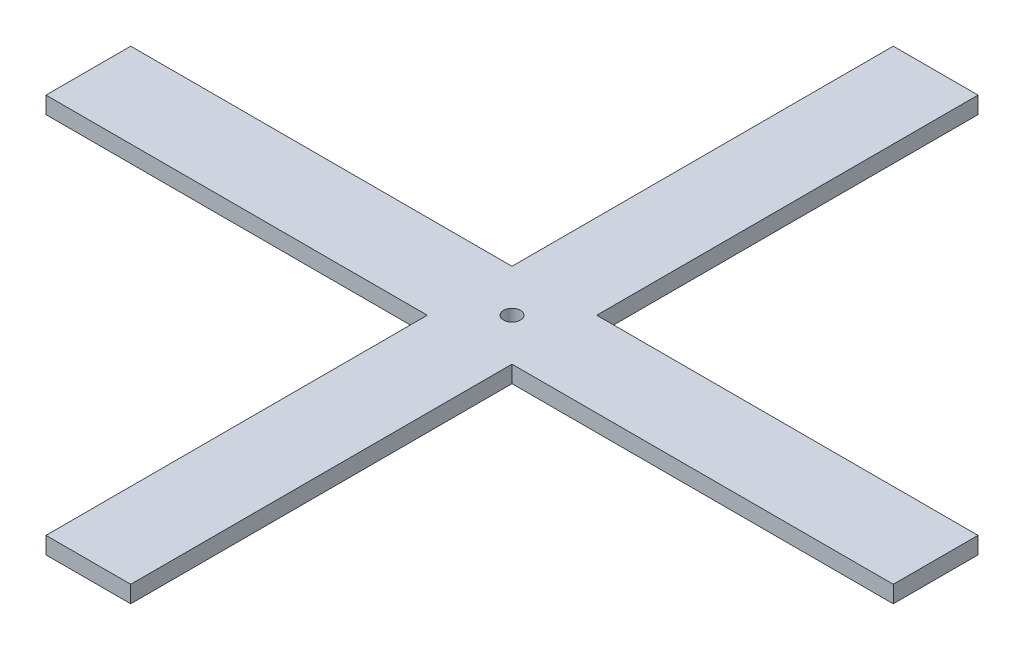
ISO-10303-21;
HEADER;
FILE_DESCRIPTION(('STEP AP214'),'2;1');
FILE_NAME('part.step','',(''),(''),'','','');
FILE_SCHEMA(('AUTOMOTIVE_DESIGN { 1 0 10303 214 1 1 1 1 }'));
ENDSEC;
DATA;
#1=APPLICATION_CONTEXT('core data for automotive mechanical design processes');
#2=APPLICATION_PROTOCOL_DEFINITION('international standard','automotive_design',2000,#1);
#3=PRODUCT_CONTEXT('',#1,'mechanical');
#4=PRODUCT('Part','Part','',(#3));
#5=PRODUCT_RELATED_PRODUCT_CATEGORY('part','',(#4));
#6=PRODUCT_DEFINITION_FORMATION('','',#4);
#7=PRODUCT_DEFINITION_CONTEXT('part definition',#1,'design');
#8=PRODUCT_DEFINITION('design','',#6,#7);
#9=PRODUCT_DEFINITION_SHAPE('','',#8);
#10=(LENGTH_UNIT() NAMED_UNIT(*) SI_UNIT(.MILLI.,.METRE.));
#11=(NAMED_UNIT(*) PLANE_ANGLE_UNIT() SI_UNIT($,.RADIAN.));
#12=(NAMED_UNIT(*) SI_UNIT($,.STERADIAN.) SOLID_ANGLE_UNIT());
#13=UNCERTAINTY_MEASURE_WITH_UNIT(LENGTH_MEASURE(1.E-05),#10,'distance_accuracy_value','');
#14=(GEOMETRIC_REPRESENTATION_CONTEXT(3) GLOBAL_UNCERTAINTY_ASSIGNED_CONTEXT((#13)) GLOBAL_UNIT_ASSIGNED_CONTEXT((#10,
#11,#12)) REPRESENTATION_CONTEXT('',''));
#15=CARTESIAN_POINT('',(0.,0.,0.));
#16=DIRECTION('',(0.,0.,1.));
#17=DIRECTION('',(1.,0.,0.));
#18=AXIS2_PLACEMENT_3D('',#15,#16,#17);
#19=CARTESIAN_POINT('',(-250.,10.,-25.));
#20=DIRECTION('',(0.,0.,1.));
#21=DIRECTION('',(1.,0.,0.));
#22=AXIS2_PLACEMENT_3D('',#19,#20,#21);
#23=PLANE('',#22);
#24=DIRECTION('',(0.,-1.,0.));
#25=VECTOR('',#24,1.);
#26=CARTESIAN_POINT('',(25.,10.,-25.));
#27=LINE('',#26,#25);
#28=CARTESIAN_POINT('',(25.,10.,-25.));
#29=VERTEX_POINT('',#28);
#30=CARTESIAN_POINT('',(25.,0.,-25.));
#31=VERTEX_POINT('',#30);
#32=EDGE_CURVE('E176',#29,#31,#27,.T.);
#33=ORIENTED_EDGE('',*,*,#32,.F.);
#34=DIRECTION('',(-1.,0.,0.));
#35=VECTOR('',#34,1.);
#36=CARTESIAN_POINT('',(-250.,10.,-25.));
#37=LINE('',#36,#35);
#38=CARTESIAN_POINT('',(250.,10.,-25.));
#39=VERTEX_POINT('',#38);
#40=EDGE_CURVE('E138',#39,#29,#37,.T.);
#41=ORIENTED_EDGE('',*,*,#40,.F.);
#42=DIRECTION('',(0.,-1.,0.));
#43=VECTOR('',#42,1.);
#44=CARTESIAN_POINT('',(250.,10.,-25.));
#45=LINE('',#44,#43);
#46=CARTESIAN_POINT('',(250.,0.,-25.));
#47=VERTEX_POINT('',#46);
#48=EDGE_CURVE('E11',#39,#47,#45,.T.);
#49=ORIENTED_EDGE('',*,*,#48,.T.);
#50=DIRECTION('',(-1.,0.,0.));
#51=VECTOR('',#50,1.);
#52=CARTESIAN_POINT('',(-250.,0.,-25.));
#53=LINE('',#52,#51);
#54=EDGE_CURVE('E198',#47,#31,#53,.T.);
#55=ORIENTED_EDGE('',*,*,#54,.T.);
#56=EDGE_LOOP('',(#33,#41,#49,#55));
#57=FACE_BOUND('',#56,.T.);
#58=ADVANCED_FACE('F39',(#57),#23,.F.);
#59=DIRECTION('',(0.,1.,0.));
#60=VECTOR('',#59,1.);
#61=CARTESIAN_POINT('',(-25.,10.,-25.));
#62=LINE('',#61,#60);
#63=CARTESIAN_POINT('',(-25.,0.,-25.));
#64=VERTEX_POINT('',#63);
#65=CARTESIAN_POINT('',(-25.,10.,-25.));
#66=VERTEX_POINT('',#65);
#67=EDGE_CURVE('E164',#64,#66,#62,.T.);
#68=ORIENTED_EDGE('',*,*,#67,.F.);
#69=CARTESIAN_POINT('',(-250.,0.,-25.));
#70=VERTEX_POINT('',#69);
#71=EDGE_CURVE('E197',#64,#70,#53,.T.);
#72=ORIENTED_EDGE('',*,*,#71,.T.);
#73=DIRECTION('',(0.,-1.,0.));
#74=VECTOR('',#73,1.);
#75=CARTESIAN_POINT('',(-250.,10.,-25.));
#76=LINE('',#75,#74);
#77=CARTESIAN_POINT('',(-250.,10.,-25.));
#78=VERTEX_POINT('',#77);
#79=EDGE_CURVE('E48',#78,#70,#76,.T.);
#80=ORIENTED_EDGE('',*,*,#79,.F.);
#81=EDGE_CURVE('E183',#66,#78,#37,.T.);
#82=ORIENTED_EDGE('',*,*,#81,.F.);
#83=EDGE_LOOP('',(#68,#72,#80,#82));
#84=FACE_BOUND('',#83,.T.);
#85=ADVANCED_FACE('F299',(#84),#23,.F.);
#86=CARTESIAN_POINT('',(-250.,10.,25.));
#87=DIRECTION('',(0.,0.,-1.));
#88=DIRECTION('',(-1.,0.,0.));
#89=AXIS2_PLACEMENT_3D('',#86,#87,#88);
#90=PLANE('',#89);
#91=DIRECTION('',(0.,1.,0.));
#92=VECTOR('',#91,1.);
#93=CARTESIAN_POINT('',(25.,10.,25.));
#94=LINE('',#93,#92);
#95=CARTESIAN_POINT('',(25.,0.,25.));
#96=VERTEX_POINT('',#95);
#97=CARTESIAN_POINT('',(25.,10.,25.));
#98=VERTEX_POINT('',#97);
#99=EDGE_CURVE('E173',#96,#98,#94,.T.);
#100=ORIENTED_EDGE('',*,*,#99,.F.);
#101=DIRECTION('',(1.,0.,0.));
#102=VECTOR('',#101,1.);
#103=CARTESIAN_POINT('',(-250.,0.,25.));
#104=LINE('',#103,#102);
#105=CARTESIAN_POINT('',(250.,0.,25.));
#106=VERTEX_POINT('',#105);
#107=EDGE_CURVE('E204',#96,#106,#104,.T.);
#108=ORIENTED_EDGE('',*,*,#107,.T.);
#109=DIRECTION('',(0.,-1.,0.));
#110=VECTOR('',#109,1.);
#111=CARTESIAN_POINT('',(250.,10.,25.));
#112=LINE('',#111,#110);
#113=CARTESIAN_POINT('',(250.,10.,25.));
#114=VERTEX_POINT('',#113);
#115=EDGE_CURVE('E193',#114,#106,#112,.T.);
#116=ORIENTED_EDGE('',*,*,#115,.F.);
#117=DIRECTION('',(1.,0.,0.));
#118=VECTOR('',#117,1.);
#119=CARTESIAN_POINT('',(-250.,10.,25.));
#120=LINE('',#119,#118);
#121=EDGE_CURVE('E55',#98,#114,#120,.T.);
#122=ORIENTED_EDGE('',*,*,#121,.F.);
#123=EDGE_LOOP('',(#100,#108,#116,#122));
#124=FACE_BOUND('',#123,.T.);
#125=ADVANCED_FACE('F304',(#124),#90,.F.);
#126=DIRECTION('',(0.,-1.,0.));
#127=VECTOR('',#126,1.);
#128=CARTESIAN_POINT('',(-25.,10.,25.));
#129=LINE('',#128,#127);
#130=CARTESIAN_POINT('',(-25.,10.,25.));
#131=VERTEX_POINT('',#130);
#132=CARTESIAN_POINT('',(-25.,0.,25.));
#133=VERTEX_POINT('',#132);
#134=EDGE_CURVE('E63',#131,#133,#129,.T.);
#135=ORIENTED_EDGE('',*,*,#134,.F.);
#136=CARTESIAN_POINT('',(-250.,10.,25.));
#137=VERTEX_POINT('',#136);
#138=EDGE_CURVE('E190',#137,#131,#120,.T.);
#139=ORIENTED_EDGE('',*,*,#138,.F.);
#140=DIRECTION('',(0.,-1.,0.));
#141=VECTOR('',#140,1.);
#142=CARTESIAN_POINT('',(-250.,10.,25.));
#143=LINE('',#142,#141);
#144=CARTESIAN_POINT('',(-250.,0.,25.));
#145=VERTEX_POINT('',#144);
#146=EDGE_CURVE('E210',#137,#145,#143,.T.);
#147=ORIENTED_EDGE('',*,*,#146,.T.);
#148=EDGE_CURVE('E184',#145,#133,#104,.T.);
#149=ORIENTED_EDGE('',*,*,#148,.T.);
#150=EDGE_LOOP('',(#135,#139,#147,#149));
#151=FACE_BOUND('',#150,.T.);
#152=ADVANCED_FACE('F230',(#151),#90,.F.);
#153=CARTESIAN_POINT('',(250.,10.,25.));
#154=DIRECTION('',(-1.,0.,0.));
#155=DIRECTION('',(0.,0.,1.));
#156=AXIS2_PLACEMENT_3D('',#153,#154,#155);
#157=PLANE('',#156);
#158=DIRECTION('',(0.,0.,-1.));
#159=VECTOR('',#158,1.);
#160=CARTESIAN_POINT('',(250.,0.,25.));
#161=LINE('',#160,#159);
#162=EDGE_CURVE('E179',#106,#47,#161,.T.);
#163=ORIENTED_EDGE('',*,*,#162,.T.);
#164=ORIENTED_EDGE('',*,*,#48,.F.);
#165=DIRECTION('',(0.,0.,-1.));
#166=VECTOR('',#165,1.);
#167=CARTESIAN_POINT('',(250.,10.,25.));
#168=LINE('',#167,#166);
#169=EDGE_CURVE('E180',#114,#39,#168,.T.);
#170=ORIENTED_EDGE('',*,*,#169,.F.);
#171=ORIENTED_EDGE('',*,*,#115,.T.);
#172=EDGE_LOOP('',(#163,#164,#170,#171));
#173=FACE_BOUND('',#172,.T.);
#174=ADVANCED_FACE('F41',(#173),#157,.F.);
#175=CARTESIAN_POINT('',(-250.,10.,25.));
#176=DIRECTION('',(1.,0.,0.));
#177=DIRECTION('',(0.,0.,-1.));
#178=AXIS2_PLACEMENT_3D('',#175,#176,#177);
#179=PLANE('',#178);
#180=DIRECTION('',(0.,0.,1.));
#181=VECTOR('',#180,1.);
#182=CARTESIAN_POINT('',(-250.,0.,25.));
#183=LINE('',#182,#181);
#184=EDGE_CURVE('E201',#70,#145,#183,.T.);
#185=ORIENTED_EDGE('',*,*,#184,.T.);
#186=ORIENTED_EDGE('',*,*,#146,.F.);
#187=DIRECTION('',(0.,0.,1.));
#188=VECTOR('',#187,1.);
#189=CARTESIAN_POINT('',(-250.,10.,25.));
#190=LINE('',#189,#188);
#191=EDGE_CURVE('E187',#78,#137,#190,.T.);
#192=ORIENTED_EDGE('',*,*,#191,.F.);
#193=ORIENTED_EDGE('',*,*,#79,.T.);
#194=EDGE_LOOP('',(#185,#186,#192,#193));
#195=FACE_BOUND('',#194,.T.);
#196=ADVANCED_FACE('F219',(#195),#179,.F.);
#197=CARTESIAN_POINT('',(0.,10.,0.));
#198=DIRECTION('',(0.,-1.,0.));
#199=DIRECTION('',(0.,0.,-1.));
#200=AXIS2_PLACEMENT_3D('',#197,#198,#199);
#201=PLANE('',#200);
#202=CARTESIAN_POINT('',(0.,10.,0.));
#203=DIRECTION('',(0.,-1.,0.));
#204=DIRECTION('',(0.,0.,-1.));
#205=AXIS2_PLACEMENT_3D('',#202,#203,#204);
#206=CIRCLE('',#205,5.);
#207=CARTESIAN_POINT('',(0.,10.,-5.));
#208=VERTEX_POINT('',#207);
#209=EDGE_CURVE('E273',#208,#208,#206,.T.);
#210=ORIENTED_EDGE('',*,*,#209,.T.);
#211=EDGE_LOOP('',(#210));
#212=FACE_BOUND('',#211,.T.);
#213=ORIENTED_EDGE('',*,*,#138,.T.);
#214=DIRECTION('',(0.,0.,1.));
#215=VECTOR('',#214,1.);
#216=CARTESIAN_POINT('',(-25.,10.,250.));
#217=LINE('',#216,#215);
#218=CARTESIAN_POINT('',(-25.,10.,250.));
#219=VERTEX_POINT('',#218);
#220=EDGE_CURVE('E154',#131,#219,#217,.T.);
#221=ORIENTED_EDGE('',*,*,#220,.T.);
#222=DIRECTION('',(1.,0.,0.));
#223=VECTOR('',#222,1.);
#224=CARTESIAN_POINT('',(-25.,10.,250.));
#225=LINE('',#224,#223);
#226=CARTESIAN_POINT('',(25.,10.,250.));
#227=VERTEX_POINT('',#226);
#228=EDGE_CURVE('E241',#219,#227,#225,.T.);
#229=ORIENTED_EDGE('',*,*,#228,.T.);
#230=DIRECTION('',(0.,0.,-1.));
#231=VECTOR('',#230,1.);
#232=CARTESIAN_POINT('',(25.,10.,250.));
#233=LINE('',#232,#231);
#234=EDGE_CURVE('E143',#227,#98,#233,.T.);
#235=ORIENTED_EDGE('',*,*,#234,.T.);
#236=ORIENTED_EDGE('',*,*,#121,.T.);
#237=ORIENTED_EDGE('',*,*,#169,.T.);
#238=ORIENTED_EDGE('',*,*,#40,.T.);
#239=CARTESIAN_POINT('',(25.,10.,-250.));
#240=VERTEX_POINT('',#239);
#241=EDGE_CURVE('E131',#29,#240,#233,.T.);
#242=ORIENTED_EDGE('',*,*,#241,.T.);
#243=DIRECTION('',(-1.,0.,0.));
#244=VECTOR('',#243,1.);
#245=CARTESIAN_POINT('',(-25.,10.,-250.));
#246=LINE('',#245,#244);
#247=CARTESIAN_POINT('',(-25.,10.,-250.));
#248=VERTEX_POINT('',#247);
#249=EDGE_CURVE('E135',#240,#248,#246,.T.);
#250=ORIENTED_EDGE('',*,*,#249,.T.);
#251=EDGE_CURVE('E238',#248,#66,#217,.T.);
#252=ORIENTED_EDGE('',*,*,#251,.T.);
#253=ORIENTED_EDGE('',*,*,#81,.T.);
#254=ORIENTED_EDGE('',*,*,#191,.T.);
#255=EDGE_LOOP('',(#213,#221,#229,#235,#236,#237,#238,#242,#250,#252,#253,#254));
#256=FACE_BOUND('',#255,.T.);
#257=ADVANCED_FACE('F133',(#212,#256),#201,.F.);
#258=CARTESIAN_POINT('',(0.,0.,0.));
#259=DIRECTION('',(0.,-1.,0.));
#260=DIRECTION('',(0.,0.,-1.));
#261=AXIS2_PLACEMENT_3D('',#258,#259,#260);
#262=PLANE('',#261);
#263=CARTESIAN_POINT('',(0.,0.,0.));
#264=DIRECTION('',(0.,1.,0.));
#265=DIRECTION('',(0.,0.,1.));
#266=AXIS2_PLACEMENT_3D('',#263,#264,#265);
#267=CIRCLE('',#266,5.);
#268=CARTESIAN_POINT('',(0.,0.,5.));
#269=VERTEX_POINT('',#268);
#270=EDGE_CURVE('E277',#269,#269,#267,.T.);
#271=ORIENTED_EDGE('',*,*,#270,.T.);
#272=EDGE_LOOP('',(#271));
#273=FACE_BOUND('',#272,.T.);
#274=ORIENTED_EDGE('',*,*,#71,.F.);
#275=DIRECTION('',(0.,0.,1.));
#276=VECTOR('',#275,1.);
#277=CARTESIAN_POINT('',(-25.,0.,250.));
#278=LINE('',#277,#276);
#279=CARTESIAN_POINT('',(-25.,0.,-250.));
#280=VERTEX_POINT('',#279);
#281=EDGE_CURVE('E253',#280,#64,#278,.T.);
#282=ORIENTED_EDGE('',*,*,#281,.F.);
#283=DIRECTION('',(-1.,0.,0.));
#284=VECTOR('',#283,1.);
#285=CARTESIAN_POINT('',(-25.,0.,-250.));
#286=LINE('',#285,#284);
#287=CARTESIAN_POINT('',(25.,0.,-250.));
#288=VERTEX_POINT('',#287);
#289=EDGE_CURVE('E250',#288,#280,#286,.T.);
#290=ORIENTED_EDGE('',*,*,#289,.F.);
#291=DIRECTION('',(0.,0.,-1.));
#292=VECTOR('',#291,1.);
#293=CARTESIAN_POINT('',(25.,0.,250.));
#294=LINE('',#293,#292);
#295=EDGE_CURVE('E158',#31,#288,#294,.T.);
#296=ORIENTED_EDGE('',*,*,#295,.F.);
#297=ORIENTED_EDGE('',*,*,#54,.F.);
#298=ORIENTED_EDGE('',*,*,#162,.F.);
#299=ORIENTED_EDGE('',*,*,#107,.F.);
#300=CARTESIAN_POINT('',(25.,0.,250.));
#301=VERTEX_POINT('',#300);
#302=EDGE_CURVE('E246',#301,#96,#294,.T.);
#303=ORIENTED_EDGE('',*,*,#302,.F.);
#304=DIRECTION('',(1.,0.,0.));
#305=VECTOR('',#304,1.);
#306=CARTESIAN_POINT('',(-25.,0.,250.));
#307=LINE('',#306,#305);
#308=CARTESIAN_POINT('',(-25.,0.,250.));
#309=VERTEX_POINT('',#308);
#310=EDGE_CURVE('E144',#309,#301,#307,.T.);
#311=ORIENTED_EDGE('',*,*,#310,.F.);
#312=EDGE_CURVE('E229',#133,#309,#278,.T.);
#313=ORIENTED_EDGE('',*,*,#312,.F.);
#314=ORIENTED_EDGE('',*,*,#148,.F.);
#315=ORIENTED_EDGE('',*,*,#184,.F.);
#316=EDGE_LOOP('',(#274,#282,#290,#296,#297,#298,#299,#303,#311,#313,#314,#315));
#317=FACE_BOUND('',#316,.T.);
#318=ADVANCED_FACE('F224',(#273,#317),#262,.T.);
#319=CARTESIAN_POINT('',(-25.,10.,250.));
#320=DIRECTION('',(0.,0.,-1.));
#321=DIRECTION('',(-1.,0.,0.));
#322=AXIS2_PLACEMENT_3D('',#319,#320,#321);
#323=PLANE('',#322);
#324=ORIENTED_EDGE('',*,*,#310,.T.);
#325=DIRECTION('',(0.,-1.,0.));
#326=VECTOR('',#325,1.);
#327=CARTESIAN_POINT('',(25.,10.,250.));
#328=LINE('',#327,#326);
#329=EDGE_CURVE('E245',#227,#301,#328,.T.);
#330=ORIENTED_EDGE('',*,*,#329,.F.);
#331=ORIENTED_EDGE('',*,*,#228,.F.);
#332=DIRECTION('',(0.,-1.,0.));
#333=VECTOR('',#332,1.);
#334=CARTESIAN_POINT('',(-25.,10.,250.));
#335=LINE('',#334,#333);
#336=EDGE_CURVE('E166',#219,#309,#335,.T.);
#337=ORIENTED_EDGE('',*,*,#336,.T.);
#338=EDGE_LOOP('',(#324,#330,#331,#337));
#339=FACE_BOUND('',#338,.T.);
#340=ADVANCED_FACE('F263',(#339),#323,.F.);
#341=CARTESIAN_POINT('',(-25.,10.,250.));
#342=DIRECTION('',(1.,0.,0.));
#343=DIRECTION('',(0.,0.,-1.));
#344=AXIS2_PLACEMENT_3D('',#341,#342,#343);
#345=PLANE('',#344);
#346=ORIENTED_EDGE('',*,*,#220,.F.);
#347=ORIENTED_EDGE('',*,*,#134,.T.);
#348=ORIENTED_EDGE('',*,*,#312,.T.);
#349=ORIENTED_EDGE('',*,*,#336,.F.);
#350=EDGE_LOOP('',(#346,#347,#348,#349));
#351=FACE_BOUND('',#350,.T.);
#352=ADVANCED_FACE('F233',(#351),#345,.F.);
#353=CARTESIAN_POINT('',(25.,10.,250.));
#354=DIRECTION('',(-1.,0.,0.));
#355=DIRECTION('',(0.,0.,1.));
#356=AXIS2_PLACEMENT_3D('',#353,#354,#355);
#357=PLANE('',#356);
#358=ORIENTED_EDGE('',*,*,#302,.T.);
#359=ORIENTED_EDGE('',*,*,#99,.T.);
#360=ORIENTED_EDGE('',*,*,#234,.F.);
#361=ORIENTED_EDGE('',*,*,#329,.T.);
#362=EDGE_LOOP('',(#358,#359,#360,#361));
#363=FACE_BOUND('',#362,.T.);
#364=ADVANCED_FACE('F268',(#363),#357,.F.);
#365=ORIENTED_EDGE('',*,*,#241,.F.);
#366=ORIENTED_EDGE('',*,*,#32,.T.);
#367=ORIENTED_EDGE('',*,*,#295,.T.);
#368=DIRECTION('',(0.,-1.,0.));
#369=VECTOR('',#368,1.);
#370=CARTESIAN_POINT('',(25.,10.,-250.));
#371=LINE('',#370,#369);
#372=EDGE_CURVE('E149',#240,#288,#371,.T.);
#373=ORIENTED_EDGE('',*,*,#372,.F.);
#374=EDGE_LOOP('',(#365,#366,#367,#373));
#375=FACE_BOUND('',#374,.T.);
#376=ADVANCED_FACE('F156',(#375),#357,.F.);
#377=ORIENTED_EDGE('',*,*,#281,.T.);
#378=ORIENTED_EDGE('',*,*,#67,.T.);
#379=ORIENTED_EDGE('',*,*,#251,.F.);
#380=DIRECTION('',(0.,-1.,0.));
#381=VECTOR('',#380,1.);
#382=CARTESIAN_POINT('',(-25.,10.,-250.));
#383=LINE('',#382,#381);
#384=EDGE_CURVE('E151',#248,#280,#383,.T.);
#385=ORIENTED_EDGE('',*,*,#384,.T.);
#386=EDGE_LOOP('',(#377,#378,#379,#385));
#387=FACE_BOUND('',#386,.T.);
#388=ADVANCED_FACE('F318',(#387),#345,.F.);
#389=CARTESIAN_POINT('',(-25.,10.,-250.));
#390=DIRECTION('',(0.,0.,1.));
#391=DIRECTION('',(1.,0.,0.));
#392=AXIS2_PLACEMENT_3D('',#389,#390,#391);
#393=PLANE('',#392);
#394=ORIENTED_EDGE('',*,*,#289,.T.);
#395=ORIENTED_EDGE('',*,*,#384,.F.);
#396=ORIENTED_EDGE('',*,*,#249,.F.);
#397=ORIENTED_EDGE('',*,*,#372,.T.);
#398=EDGE_LOOP('',(#394,#395,#396,#397));
#399=FACE_BOUND('',#398,.T.);
#400=ADVANCED_FACE('F148',(#399),#393,.F.);
#401=CARTESIAN_POINT('',(0.,0.,0.));
#402=DIRECTION('',(0.,1.,0.));
#403=DIRECTION('',(0.,0.,1.));
#404=AXIS2_PLACEMENT_3D('',#401,#402,#403);
#405=CYLINDRICAL_SURFACE('',#404,5.);
#406=ORIENTED_EDGE('',*,*,#270,.F.);
#407=EDGE_LOOP('',(#406));
#408=FACE_BOUND('',#407,.T.);
#409=ORIENTED_EDGE('',*,*,#209,.F.);
#410=EDGE_LOOP('',(#409));
#411=FACE_BOUND('',#410,.T.);
#412=ADVANCED_FACE('F283',(#408,#411),#405,.F.);
#413=CLOSED_SHELL('',(#58,#85,#125,#152,#174,#196,#257,#318,#340,#352,#364,#376,#388,#400,#412));
#414=MANIFOLD_SOLID_BREP('B2',#413);
#415=ADVANCED_BREP_SHAPE_REPRESENTATION('',(#18,#414),#14);
#416=SHAPE_DEFINITION_REPRESENTATION(#9,#415);
ENDSEC;
END-ISO-10303-21;
